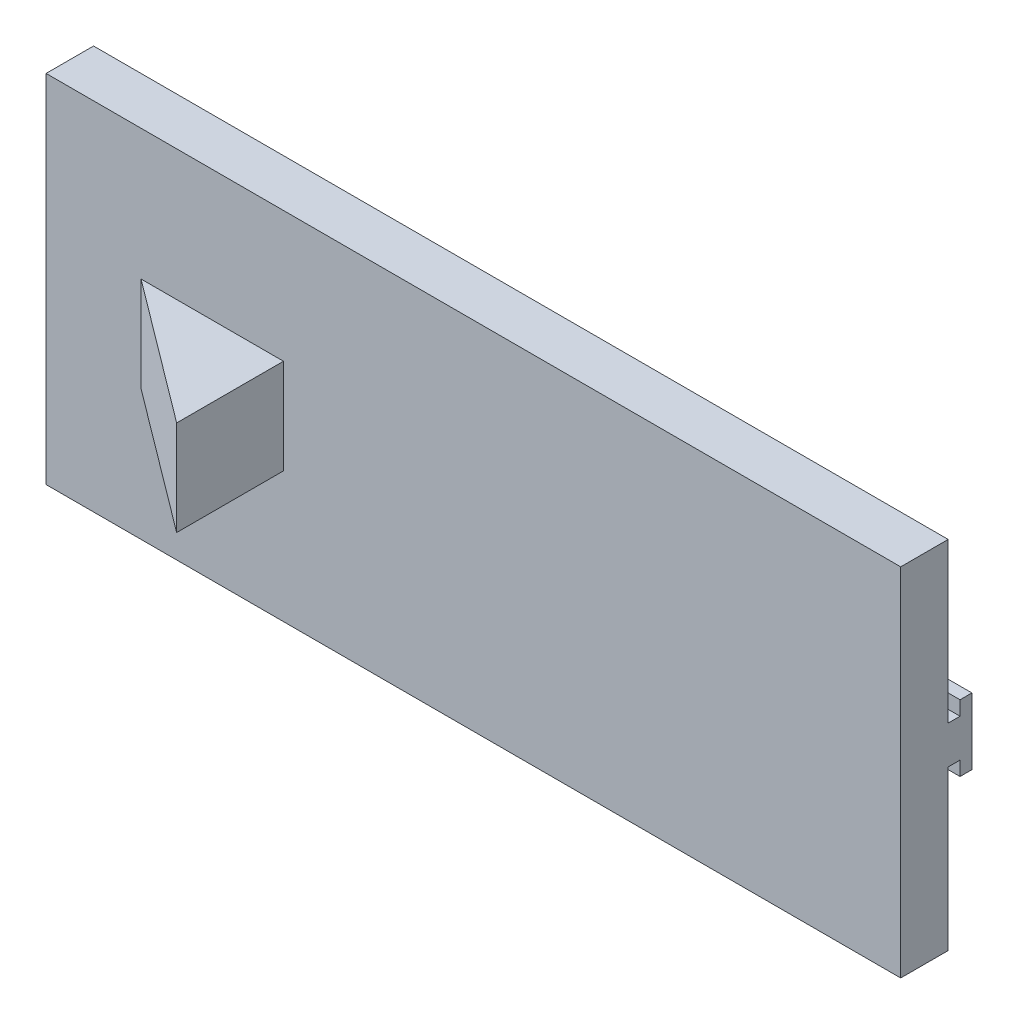
ISO-10303-21;
HEADER;
FILE_DESCRIPTION(('STEP AP214'),'2;1');
FILE_NAME('part.step','',(''),(''),'','','');
FILE_SCHEMA(('AUTOMOTIVE_DESIGN { 1 0 10303 214 1 1 1 1 }'));
ENDSEC;
DATA;
#1=APPLICATION_CONTEXT('core data for automotive mechanical design processes');
#2=APPLICATION_PROTOCOL_DEFINITION('international standard','automotive_design',2000,#1);
#3=PRODUCT_CONTEXT('',#1,'mechanical');
#4=PRODUCT('Part','Part','',(#3));
#5=PRODUCT_RELATED_PRODUCT_CATEGORY('part','',(#4));
#6=PRODUCT_DEFINITION_FORMATION('','',#4);
#7=PRODUCT_DEFINITION_CONTEXT('part definition',#1,'design');
#8=PRODUCT_DEFINITION('design','',#6,#7);
#9=PRODUCT_DEFINITION_SHAPE('','',#8);
#10=(LENGTH_UNIT() NAMED_UNIT(*) SI_UNIT(.MILLI.,.METRE.));
#11=(NAMED_UNIT(*) PLANE_ANGLE_UNIT() SI_UNIT($,.RADIAN.));
#12=(NAMED_UNIT(*) SI_UNIT($,.STERADIAN.) SOLID_ANGLE_UNIT());
#13=UNCERTAINTY_MEASURE_WITH_UNIT(LENGTH_MEASURE(1.E-05),#10,'distance_accuracy_value','');
#14=(GEOMETRIC_REPRESENTATION_CONTEXT(3) GLOBAL_UNCERTAINTY_ASSIGNED_CONTEXT((#13)) GLOBAL_UNIT_ASSIGNED_CONTEXT((#10,
#11,#12)) REPRESENTATION_CONTEXT('',''));
#15=CARTESIAN_POINT('',(0.,0.,0.));
#16=DIRECTION('',(0.,0.,1.));
#17=DIRECTION('',(1.,0.,0.));
#18=AXIS2_PLACEMENT_3D('',#15,#16,#17);
#19=CARTESIAN_POINT('',(0.,0.,25.4));
#20=DIRECTION('',(0.,0.,-1.));
#21=DIRECTION('',(-1.,0.,0.));
#22=AXIS2_PLACEMENT_3D('',#19,#20,#21);
#23=PLANE('',#22);
#24=DIRECTION('',(0.,1.,0.));
#25=VECTOR('',#24,1.);
#26=CARTESIAN_POINT('',(228.6,-95.25,25.4));
#27=LINE('',#26,#25);
#28=CARTESIAN_POINT('',(228.6,-95.25,25.4));
#29=VERTEX_POINT('',#28);
#30=CARTESIAN_POINT('',(228.6,95.25,25.4));
#31=VERTEX_POINT('',#30);
#32=EDGE_CURVE('E223',#29,#31,#27,.T.);
#33=ORIENTED_EDGE('',*,*,#32,.T.);
#34=DIRECTION('',(-1.,0.,0.));
#35=VECTOR('',#34,1.);
#36=CARTESIAN_POINT('',(-228.6,95.25,25.4));
#37=LINE('',#36,#35);
#38=CARTESIAN_POINT('',(-228.6,95.25,25.4));
#39=VERTEX_POINT('',#38);
#40=EDGE_CURVE('E226',#31,#39,#37,.T.);
#41=ORIENTED_EDGE('',*,*,#40,.T.);
#42=DIRECTION('',(0.,-1.,0.));
#43=VECTOR('',#42,1.);
#44=CARTESIAN_POINT('',(-228.6,-95.25,25.4));
#45=LINE('',#44,#43);
#46=CARTESIAN_POINT('',(-228.6,-95.25,25.4));
#47=VERTEX_POINT('',#46);
#48=EDGE_CURVE('E229',#39,#47,#45,.T.);
#49=ORIENTED_EDGE('',*,*,#48,.T.);
#50=DIRECTION('',(1.,0.,0.));
#51=VECTOR('',#50,1.);
#52=CARTESIAN_POINT('',(-228.6,-95.25,25.4));
#53=LINE('',#52,#51);
#54=EDGE_CURVE('E231',#47,#29,#53,.T.);
#55=ORIENTED_EDGE('',*,*,#54,.T.);
#56=EDGE_LOOP('',(#33,#41,#49,#55));
#57=FACE_BOUND('',#56,.T.);
#58=DIRECTION('',(-1.,0.,0.));
#59=VECTOR('',#58,1.);
#60=CARTESIAN_POINT('',(-177.8,-25.4,25.4));
#61=LINE('',#60,#59);
#62=CARTESIAN_POINT('',(-101.6,-25.4,25.4));
#63=VERTEX_POINT('',#62);
#64=CARTESIAN_POINT('',(-177.8,-25.4,25.4));
#65=VERTEX_POINT('',#64);
#66=EDGE_CURVE('E154',#63,#65,#61,.T.);
#67=ORIENTED_EDGE('',*,*,#66,.T.);
#68=DIRECTION('',(0.,1.,0.));
#69=VECTOR('',#68,1.);
#70=CARTESIAN_POINT('',(-177.8,-25.4,25.4));
#71=LINE('',#70,#69);
#72=CARTESIAN_POINT('',(-177.8,25.4,25.4));
#73=VERTEX_POINT('',#72);
#74=EDGE_CURVE('E170',#65,#73,#71,.T.);
#75=ORIENTED_EDGE('',*,*,#74,.T.);
#76=DIRECTION('',(-1.,0.,0.));
#77=VECTOR('',#76,1.);
#78=CARTESIAN_POINT('',(-177.8,25.4,25.4));
#79=LINE('',#78,#77);
#80=CARTESIAN_POINT('',(-101.6,25.4,25.4));
#81=VERTEX_POINT('',#80);
#82=EDGE_CURVE('E159',#81,#73,#79,.T.);
#83=ORIENTED_EDGE('',*,*,#82,.F.);
#84=DIRECTION('',(0.,1.,0.));
#85=VECTOR('',#84,1.);
#86=CARTESIAN_POINT('',(-101.6,-25.4,25.4));
#87=LINE('',#86,#85);
#88=EDGE_CURVE('E153',#63,#81,#87,.T.);
#89=ORIENTED_EDGE('',*,*,#88,.F.);
#90=EDGE_LOOP('',(#67,#75,#83,#89));
#91=FACE_BOUND('',#90,.T.);
#92=ADVANCED_FACE('F37',(#57,#91),#23,.F.);
#93=CARTESIAN_POINT('',(0.,0.,0.));
#94=DIRECTION('',(0.,0.,-1.));
#95=DIRECTION('',(-1.,0.,0.));
#96=AXIS2_PLACEMENT_3D('',#93,#94,#95);
#97=PLANE('',#96);
#98=DIRECTION('',(1.,0.,0.));
#99=VECTOR('',#98,1.);
#100=CARTESIAN_POINT('',(228.6,10.16,0.));
#101=LINE('',#100,#99);
#102=CARTESIAN_POINT('',(-228.6,10.1600000000001,0.));
#103=VERTEX_POINT('',#102);
#104=CARTESIAN_POINT('',(228.6,10.1600000000001,0.));
#105=VERTEX_POINT('',#104);
#106=EDGE_CURVE('E208',#103,#105,#101,.T.);
#107=ORIENTED_EDGE('',*,*,#106,.F.);
#108=DIRECTION('',(0.,-1.,0.));
#109=VECTOR('',#108,1.);
#110=CARTESIAN_POINT('',(-228.6,-95.25,0.));
#111=LINE('',#110,#109);
#112=CARTESIAN_POINT('',(-228.6,95.25,0.));
#113=VERTEX_POINT('',#112);
#114=EDGE_CURVE('E240',#113,#103,#111,.T.);
#115=ORIENTED_EDGE('',*,*,#114,.F.);
#116=DIRECTION('',(-1.,0.,0.));
#117=VECTOR('',#116,1.);
#118=CARTESIAN_POINT('',(-228.6,95.25,0.));
#119=LINE('',#118,#117);
#120=CARTESIAN_POINT('',(228.6,95.25,0.));
#121=VERTEX_POINT('',#120);
#122=EDGE_CURVE('E237',#121,#113,#119,.T.);
#123=ORIENTED_EDGE('',*,*,#122,.F.);
#124=DIRECTION('',(0.,1.,0.));
#125=VECTOR('',#124,1.);
#126=CARTESIAN_POINT('',(228.6,-95.25,0.));
#127=LINE('',#126,#125);
#128=EDGE_CURVE('E222',#105,#121,#127,.T.);
#129=ORIENTED_EDGE('',*,*,#128,.F.);
#130=EDGE_LOOP('',(#107,#115,#123,#129));
#131=FACE_BOUND('',#130,.T.);
#132=ADVANCED_FACE('F266',(#131),#97,.T.);
#133=CARTESIAN_POINT('',(228.6,-95.25,25.4));
#134=DIRECTION('',(-1.,0.,0.));
#135=DIRECTION('',(0.,0.,1.));
#136=AXIS2_PLACEMENT_3D('',#133,#134,#135);
#137=PLANE('',#136);
#138=DIRECTION('',(0.,0.,1.));
#139=VECTOR('',#138,1.);
#140=CARTESIAN_POINT('',(228.6,-10.16,-12.7));
#141=LINE('',#140,#139);
#142=CARTESIAN_POINT('',(228.6,-10.16,-6.35));
#143=VERTEX_POINT('',#142);
#144=CARTESIAN_POINT('',(228.6,-10.16,0.));
#145=VERTEX_POINT('',#144);
#146=EDGE_CURVE('E220',#143,#145,#141,.T.);
#147=ORIENTED_EDGE('',*,*,#146,.F.);
#148=DIRECTION('',(0.,1.,0.));
#149=VECTOR('',#148,1.);
#150=CARTESIAN_POINT('',(228.6,-17.78,-6.35));
#151=LINE('',#150,#149);
#152=CARTESIAN_POINT('',(228.6,-17.78,-6.35));
#153=VERTEX_POINT('',#152);
#154=EDGE_CURVE('E60',#153,#143,#151,.T.);
#155=ORIENTED_EDGE('',*,*,#154,.F.);
#156=DIRECTION('',(0.,0.,-1.));
#157=VECTOR('',#156,1.);
#158=CARTESIAN_POINT('',(228.6,-17.78,-12.7));
#159=LINE('',#158,#157);
#160=CARTESIAN_POINT('',(228.6,-17.78,-12.7));
#161=VERTEX_POINT('',#160);
#162=EDGE_CURVE('E190',#153,#161,#159,.T.);
#163=ORIENTED_EDGE('',*,*,#162,.T.);
#164=DIRECTION('',(0.,-1.,0.));
#165=VECTOR('',#164,1.);
#166=CARTESIAN_POINT('',(228.6,10.16,-12.7));
#167=LINE('',#166,#165);
#168=CARTESIAN_POINT('',(228.6,17.78,-12.7));
#169=VERTEX_POINT('',#168);
#170=EDGE_CURVE('E205',#169,#161,#167,.T.);
#171=ORIENTED_EDGE('',*,*,#170,.F.);
#172=DIRECTION('',(0.,0.,-1.));
#173=VECTOR('',#172,1.);
#174=CARTESIAN_POINT('',(228.6,17.78,-12.7));
#175=LINE('',#174,#173);
#176=CARTESIAN_POINT('',(228.6,17.78,-6.35));
#177=VERTEX_POINT('',#176);
#178=EDGE_CURVE('E179',#177,#169,#175,.T.);
#179=ORIENTED_EDGE('',*,*,#178,.F.);
#180=CARTESIAN_POINT('',(228.6,10.1600000000001,-6.35));
#181=VERTEX_POINT('',#180);
#182=EDGE_CURVE('E199',#181,#177,#151,.T.);
#183=ORIENTED_EDGE('',*,*,#182,.F.);
#184=DIRECTION('',(0.,0.,1.));
#185=VECTOR('',#184,1.);
#186=CARTESIAN_POINT('',(228.6,10.16,-12.7));
#187=LINE('',#186,#185);
#188=EDGE_CURVE('E210',#181,#105,#187,.T.);
#189=ORIENTED_EDGE('',*,*,#188,.T.);
#190=ORIENTED_EDGE('',*,*,#128,.T.);
#191=DIRECTION('',(0.,0.,-1.));
#192=VECTOR('',#191,1.);
#193=CARTESIAN_POINT('',(228.6,95.25,25.4));
#194=LINE('',#193,#192);
#195=EDGE_CURVE('E45',#31,#121,#194,.T.);
#196=ORIENTED_EDGE('',*,*,#195,.F.);
#197=ORIENTED_EDGE('',*,*,#32,.F.);
#198=DIRECTION('',(0.,0.,-1.));
#199=VECTOR('',#198,1.);
#200=CARTESIAN_POINT('',(228.6,-95.25,25.4));
#201=LINE('',#200,#199);
#202=CARTESIAN_POINT('',(228.6,-95.25,0.));
#203=VERTEX_POINT('',#202);
#204=EDGE_CURVE('E233',#29,#203,#201,.T.);
#205=ORIENTED_EDGE('',*,*,#204,.T.);
#206=EDGE_CURVE('E234',#203,#145,#127,.T.);
#207=ORIENTED_EDGE('',*,*,#206,.T.);
#208=EDGE_LOOP('',(#147,#155,#163,#171,#179,#183,#189,#190,#196,#197,#205,#207));
#209=FACE_BOUND('',#208,.T.);
#210=ADVANCED_FACE('F39',(#209),#137,.F.);
#211=CARTESIAN_POINT('',(-228.6,95.25,25.4));
#212=DIRECTION('',(0.,-1.,0.));
#213=DIRECTION('',(0.,0.,-1.));
#214=AXIS2_PLACEMENT_3D('',#211,#212,#213);
#215=PLANE('',#214);
#216=ORIENTED_EDGE('',*,*,#122,.T.);
#217=DIRECTION('',(0.,0.,-1.));
#218=VECTOR('',#217,1.);
#219=CARTESIAN_POINT('',(-228.6,95.25,25.4));
#220=LINE('',#219,#218);
#221=EDGE_CURVE('E249',#39,#113,#220,.T.);
#222=ORIENTED_EDGE('',*,*,#221,.F.);
#223=ORIENTED_EDGE('',*,*,#40,.F.);
#224=ORIENTED_EDGE('',*,*,#195,.T.);
#225=EDGE_LOOP('',(#216,#222,#223,#224));
#226=FACE_BOUND('',#225,.T.);
#227=ADVANCED_FACE('F254',(#226),#215,.F.);
#228=CARTESIAN_POINT('',(-228.6,-95.25,25.4));
#229=DIRECTION('',(1.,0.,0.));
#230=DIRECTION('',(0.,0.,-1.));
#231=AXIS2_PLACEMENT_3D('',#228,#229,#230);
#232=PLANE('',#231);
#233=DIRECTION('',(0.,0.,1.));
#234=VECTOR('',#233,1.);
#235=CARTESIAN_POINT('',(-228.6,10.1600000000003,-12.7));
#236=LINE('',#235,#234);
#237=CARTESIAN_POINT('',(-228.6,10.1600000000003,-6.35));
#238=VERTEX_POINT('',#237);
#239=EDGE_CURVE('E216',#238,#103,#236,.T.);
#240=ORIENTED_EDGE('',*,*,#239,.F.);
#241=DIRECTION('',(0.,1.,0.));
#242=VECTOR('',#241,1.);
#243=CARTESIAN_POINT('',(-228.6,-17.7799999999997,-6.35));
#244=LINE('',#243,#242);
#245=CARTESIAN_POINT('',(-228.6,17.7800000000003,-6.35));
#246=VERTEX_POINT('',#245);
#247=EDGE_CURVE('E196',#238,#246,#244,.T.);
#248=ORIENTED_EDGE('',*,*,#247,.T.);
#249=DIRECTION('',(0.,0.,1.));
#250=VECTOR('',#249,1.);
#251=CARTESIAN_POINT('',(-228.6,17.7800000000003,-12.7));
#252=LINE('',#251,#250);
#253=CARTESIAN_POINT('',(-228.6,17.7800000000003,-12.7));
#254=VERTEX_POINT('',#253);
#255=EDGE_CURVE('E172',#254,#246,#252,.T.);
#256=ORIENTED_EDGE('',*,*,#255,.F.);
#257=DIRECTION('',(0.,1.,0.));
#258=VECTOR('',#257,1.);
#259=CARTESIAN_POINT('',(-228.6,10.1600000000003,-12.7));
#260=LINE('',#259,#258);
#261=CARTESIAN_POINT('',(-228.6,-17.7799999999997,-12.7));
#262=VERTEX_POINT('',#261);
#263=EDGE_CURVE('E207',#262,#254,#260,.T.);
#264=ORIENTED_EDGE('',*,*,#263,.F.);
#265=DIRECTION('',(0.,0.,1.));
#266=VECTOR('',#265,1.);
#267=CARTESIAN_POINT('',(-228.6,-17.7799999999997,-12.7));
#268=LINE('',#267,#266);
#269=CARTESIAN_POINT('',(-228.6,-17.7799999999997,-6.35));
#270=VERTEX_POINT('',#269);
#271=EDGE_CURVE('E185',#262,#270,#268,.T.);
#272=ORIENTED_EDGE('',*,*,#271,.T.);
#273=CARTESIAN_POINT('',(-228.6,-10.16,-6.35));
#274=VERTEX_POINT('',#273);
#275=EDGE_CURVE('E200',#270,#274,#244,.T.);
#276=ORIENTED_EDGE('',*,*,#275,.T.);
#277=DIRECTION('',(0.,0.,1.));
#278=VECTOR('',#277,1.);
#279=CARTESIAN_POINT('',(-228.6,-10.16,-12.7));
#280=LINE('',#279,#278);
#281=CARTESIAN_POINT('',(-228.6,-10.16,0.));
#282=VERTEX_POINT('',#281);
#283=EDGE_CURVE('E218',#274,#282,#280,.T.);
#284=ORIENTED_EDGE('',*,*,#283,.T.);
#285=CARTESIAN_POINT('',(-228.6,-95.25,0.));
#286=VERTEX_POINT('',#285);
#287=EDGE_CURVE('E239',#282,#286,#111,.T.);
#288=ORIENTED_EDGE('',*,*,#287,.T.);
#289=DIRECTION('',(0.,0.,-1.));
#290=VECTOR('',#289,1.);
#291=CARTESIAN_POINT('',(-228.6,-95.25,25.4));
#292=LINE('',#291,#290);
#293=EDGE_CURVE('E246',#47,#286,#292,.T.);
#294=ORIENTED_EDGE('',*,*,#293,.F.);
#295=ORIENTED_EDGE('',*,*,#48,.F.);
#296=ORIENTED_EDGE('',*,*,#221,.T.);
#297=ORIENTED_EDGE('',*,*,#114,.T.);
#298=EDGE_LOOP('',(#240,#248,#256,#264,#272,#276,#284,#288,#294,#295,#296,#297));
#299=FACE_BOUND('',#298,.T.);
#300=ADVANCED_FACE('F269',(#299),#232,.F.);
#301=CARTESIAN_POINT('',(-228.6,-95.25,25.4));
#302=DIRECTION('',(0.,1.,0.));
#303=DIRECTION('',(0.,0.,1.));
#304=AXIS2_PLACEMENT_3D('',#301,#302,#303);
#305=PLANE('',#304);
#306=DIRECTION('',(1.,0.,0.));
#307=VECTOR('',#306,1.);
#308=CARTESIAN_POINT('',(-228.6,-95.25,0.));
#309=LINE('',#308,#307);
#310=EDGE_CURVE('E227',#286,#203,#309,.T.);
#311=ORIENTED_EDGE('',*,*,#310,.T.);
#312=ORIENTED_EDGE('',*,*,#204,.F.);
#313=ORIENTED_EDGE('',*,*,#54,.F.);
#314=ORIENTED_EDGE('',*,*,#293,.T.);
#315=EDGE_LOOP('',(#311,#312,#313,#314));
#316=FACE_BOUND('',#315,.T.);
#317=ADVANCED_FACE('F277',(#316),#305,.F.);
#318=DIRECTION('',(-1.,0.,0.));
#319=VECTOR('',#318,1.);
#320=CARTESIAN_POINT('',(228.6,-10.16,0.));
#321=LINE('',#320,#319);
#322=EDGE_CURVE('E204',#145,#282,#321,.T.);
#323=ORIENTED_EDGE('',*,*,#322,.F.);
#324=ORIENTED_EDGE('',*,*,#206,.F.);
#325=ORIENTED_EDGE('',*,*,#310,.F.);
#326=ORIENTED_EDGE('',*,*,#287,.F.);
#327=EDGE_LOOP('',(#323,#324,#325,#326));
#328=FACE_BOUND('',#327,.T.);
#329=ADVANCED_FACE('F282',(#328),#97,.T.);
#330=CARTESIAN_POINT('',(228.6,-10.16,-12.7));
#331=DIRECTION('',(0.,1.,0.));
#332=DIRECTION('',(0.,0.,1.));
#333=AXIS2_PLACEMENT_3D('',#330,#331,#332);
#334=PLANE('',#333);
#335=ORIENTED_EDGE('',*,*,#283,.F.);
#336=DIRECTION('',(1.,0.,0.));
#337=VECTOR('',#336,1.);
#338=CARTESIAN_POINT('',(228.6,-10.16,-6.35));
#339=LINE('',#338,#337);
#340=EDGE_CURVE('E198',#274,#143,#339,.T.);
#341=ORIENTED_EDGE('',*,*,#340,.T.);
#342=ORIENTED_EDGE('',*,*,#146,.T.);
#343=ORIENTED_EDGE('',*,*,#322,.T.);
#344=EDGE_LOOP('',(#335,#341,#342,#343));
#345=FACE_BOUND('',#344,.T.);
#346=ADVANCED_FACE('F286',(#345),#334,.F.);
#347=CARTESIAN_POINT('',(228.6,10.16,-12.7));
#348=DIRECTION('',(0.,-1.,0.));
#349=DIRECTION('',(1.,0.,0.));
#350=AXIS2_PLACEMENT_3D('',#347,#348,#349);
#351=PLANE('',#350);
#352=ORIENTED_EDGE('',*,*,#188,.F.);
#353=DIRECTION('',(-1.,0.,0.));
#354=VECTOR('',#353,1.);
#355=CARTESIAN_POINT('',(228.6,10.16,-6.35));
#356=LINE('',#355,#354);
#357=EDGE_CURVE('E11',#181,#238,#356,.T.);
#358=ORIENTED_EDGE('',*,*,#357,.T.);
#359=ORIENTED_EDGE('',*,*,#239,.T.);
#360=ORIENTED_EDGE('',*,*,#106,.T.);
#361=EDGE_LOOP('',(#352,#358,#359,#360));
#362=FACE_BOUND('',#361,.T.);
#363=ADVANCED_FACE('F305',(#362),#351,.F.);
#364=CARTESIAN_POINT('',(0.,0.,-12.7));
#365=DIRECTION('',(0.,0.,-1.));
#366=DIRECTION('',(-1.,0.,0.));
#367=AXIS2_PLACEMENT_3D('',#364,#365,#366);
#368=PLANE('',#367);
#369=ORIENTED_EDGE('',*,*,#170,.T.);
#370=DIRECTION('',(-1.,0.,0.));
#371=VECTOR('',#370,1.);
#372=CARTESIAN_POINT('',(-228.6,-17.7799999999997,-12.7));
#373=LINE('',#372,#371);
#374=EDGE_CURVE('E193',#161,#262,#373,.T.);
#375=ORIENTED_EDGE('',*,*,#374,.T.);
#376=ORIENTED_EDGE('',*,*,#263,.T.);
#377=DIRECTION('',(-1.,0.,0.));
#378=VECTOR('',#377,1.);
#379=CARTESIAN_POINT('',(-228.6,17.7800000000003,-12.7));
#380=LINE('',#379,#378);
#381=EDGE_CURVE('E182',#169,#254,#380,.T.);
#382=ORIENTED_EDGE('',*,*,#381,.F.);
#383=EDGE_LOOP('',(#369,#375,#376,#382));
#384=FACE_BOUND('',#383,.T.);
#385=ADVANCED_FACE('F296',(#384),#368,.T.);
#386=CARTESIAN_POINT('',(0.,17.7800000000001,0.));
#387=DIRECTION('',(0.,1.,0.));
#388=DIRECTION('',(-1.,0.,0.));
#389=AXIS2_PLACEMENT_3D('',#386,#387,#388);
#390=PLANE('',#389);
#391=ORIENTED_EDGE('',*,*,#255,.T.);
#392=DIRECTION('',(1.,0.,0.));
#393=VECTOR('',#392,1.);
#394=CARTESIAN_POINT('',(-228.6,17.7800000000003,-6.35));
#395=LINE('',#394,#393);
#396=EDGE_CURVE('E176',#246,#177,#395,.T.);
#397=ORIENTED_EDGE('',*,*,#396,.T.);
#398=ORIENTED_EDGE('',*,*,#178,.T.);
#399=ORIENTED_EDGE('',*,*,#381,.T.);
#400=EDGE_LOOP('',(#391,#397,#398,#399));
#401=FACE_BOUND('',#400,.T.);
#402=ADVANCED_FACE('F300',(#401),#390,.T.);
#403=CARTESIAN_POINT('',(-228.6,-17.7799999999997,-6.35));
#404=DIRECTION('',(0.,0.,1.));
#405=DIRECTION('',(1.,0.,0.));
#406=AXIS2_PLACEMENT_3D('',#403,#404,#405);
#407=PLANE('',#406);
#408=ORIENTED_EDGE('',*,*,#357,.F.);
#409=ORIENTED_EDGE('',*,*,#182,.T.);
#410=ORIENTED_EDGE('',*,*,#396,.F.);
#411=ORIENTED_EDGE('',*,*,#247,.F.);
#412=EDGE_LOOP('',(#408,#409,#410,#411));
#413=FACE_BOUND('',#412,.T.);
#414=ADVANCED_FACE('F303',(#413),#407,.T.);
#415=ORIENTED_EDGE('',*,*,#340,.F.);
#416=ORIENTED_EDGE('',*,*,#275,.F.);
#417=DIRECTION('',(1.,0.,0.));
#418=VECTOR('',#417,1.);
#419=CARTESIAN_POINT('',(-228.6,-17.7799999999997,-6.35));
#420=LINE('',#419,#418);
#421=EDGE_CURVE('E188',#270,#153,#420,.T.);
#422=ORIENTED_EDGE('',*,*,#421,.T.);
#423=ORIENTED_EDGE('',*,*,#154,.T.);
#424=EDGE_LOOP('',(#415,#416,#422,#423));
#425=FACE_BOUND('',#424,.T.);
#426=ADVANCED_FACE('F293',(#425),#407,.T.);
#427=CARTESIAN_POINT('',(0.,-17.7799999999999,0.));
#428=DIRECTION('',(0.,1.,0.));
#429=DIRECTION('',(-1.,0.,0.));
#430=AXIS2_PLACEMENT_3D('',#427,#428,#429);
#431=PLANE('',#430);
#432=ORIENTED_EDGE('',*,*,#271,.F.);
#433=ORIENTED_EDGE('',*,*,#374,.F.);
#434=ORIENTED_EDGE('',*,*,#162,.F.);
#435=ORIENTED_EDGE('',*,*,#421,.F.);
#436=EDGE_LOOP('',(#432,#433,#434,#435));
#437=FACE_BOUND('',#436,.T.);
#438=ADVANCED_FACE('F292',(#437),#431,.F.);
#439=CARTESIAN_POINT('',(-101.6,-25.4,82.55));
#440=DIRECTION('',(-0.6,0.,0.8));
#441=DIRECTION('',(0.8,0.,0.6));
#442=AXIS2_PLACEMENT_3D('',#439,#440,#441);
#443=PLANE('',#442);
#444=DIRECTION('',(0.,1.,0.));
#445=VECTOR('',#444,1.);
#446=CARTESIAN_POINT('',(-101.6,-25.4,82.55));
#447=LINE('',#446,#445);
#448=CARTESIAN_POINT('',(-101.6,-25.4,82.55));
#449=VERTEX_POINT('',#448);
#450=CARTESIAN_POINT('',(-101.6,25.4,82.55));
#451=VERTEX_POINT('',#450);
#452=EDGE_CURVE('E145',#449,#451,#447,.T.);
#453=ORIENTED_EDGE('',*,*,#452,.T.);
#454=DIRECTION('',(0.8,0.,0.6));
#455=VECTOR('',#454,1.);
#456=CARTESIAN_POINT('',(-101.6,25.4,82.55));
#457=LINE('',#456,#455);
#458=EDGE_CURVE('E147',#73,#451,#457,.T.);
#459=ORIENTED_EDGE('',*,*,#458,.F.);
#460=ORIENTED_EDGE('',*,*,#74,.F.);
#461=DIRECTION('',(0.8,0.,0.6));
#462=VECTOR('',#461,1.);
#463=CARTESIAN_POINT('',(-101.6,-25.4,82.55));
#464=LINE('',#463,#462);
#465=EDGE_CURVE('E150',#65,#449,#464,.T.);
#466=ORIENTED_EDGE('',*,*,#465,.T.);
#467=EDGE_LOOP('',(#453,#459,#460,#466));
#468=FACE_BOUND('',#467,.T.);
#469=ADVANCED_FACE('F146',(#468),#443,.T.);
#470=CARTESIAN_POINT('',(-101.6,-25.4,25.4));
#471=DIRECTION('',(1.,0.,0.));
#472=DIRECTION('',(0.,0.,-1.));
#473=AXIS2_PLACEMENT_3D('',#470,#471,#472);
#474=PLANE('',#473);
#475=ORIENTED_EDGE('',*,*,#88,.T.);
#476=DIRECTION('',(0.,0.,-1.));
#477=VECTOR('',#476,1.);
#478=CARTESIAN_POINT('',(-101.6,25.4,25.4));
#479=LINE('',#478,#477);
#480=EDGE_CURVE('E52',#451,#81,#479,.T.);
#481=ORIENTED_EDGE('',*,*,#480,.F.);
#482=ORIENTED_EDGE('',*,*,#452,.F.);
#483=DIRECTION('',(0.,0.,-1.));
#484=VECTOR('',#483,1.);
#485=CARTESIAN_POINT('',(-101.6,-25.4,25.4));
#486=LINE('',#485,#484);
#487=EDGE_CURVE('E166',#449,#63,#486,.T.);
#488=ORIENTED_EDGE('',*,*,#487,.T.);
#489=EDGE_LOOP('',(#475,#481,#482,#488));
#490=FACE_BOUND('',#489,.T.);
#491=ADVANCED_FACE('F156',(#490),#474,.T.);
#492=CARTESIAN_POINT('',(0.,-25.4,0.));
#493=DIRECTION('',(0.,1.,0.));
#494=DIRECTION('',(0.,0.,1.));
#495=AXIS2_PLACEMENT_3D('',#492,#493,#494);
#496=PLANE('',#495);
#497=ORIENTED_EDGE('',*,*,#465,.F.);
#498=ORIENTED_EDGE('',*,*,#66,.F.);
#499=ORIENTED_EDGE('',*,*,#487,.F.);
#500=EDGE_LOOP('',(#497,#498,#499));
#501=FACE_BOUND('',#500,.T.);
#502=ADVANCED_FACE('F419',(#501),#496,.F.);
#503=CARTESIAN_POINT('',(0.,25.4,0.));
#504=DIRECTION('',(0.,1.,0.));
#505=DIRECTION('',(0.,0.,1.));
#506=AXIS2_PLACEMENT_3D('',#503,#504,#505);
#507=PLANE('',#506);
#508=ORIENTED_EDGE('',*,*,#458,.T.);
#509=ORIENTED_EDGE('',*,*,#480,.T.);
#510=ORIENTED_EDGE('',*,*,#82,.T.);
#511=EDGE_LOOP('',(#508,#509,#510));
#512=FACE_BOUND('',#511,.T.);
#513=ADVANCED_FACE('F161',(#512),#507,.T.);
#514=CLOSED_SHELL('',(#92,#132,#210,#227,#300,#317,#329,#346,#363,#385,#402,#414,#426,#438,#469,
#491,#502,#513));
#515=MANIFOLD_SOLID_BREP('B2',#514);
#516=ADVANCED_BREP_SHAPE_REPRESENTATION('',(#18,#515),#14);
#517=SHAPE_DEFINITION_REPRESENTATION(#9,#516);
ENDSEC;
END-ISO-10303-21;
